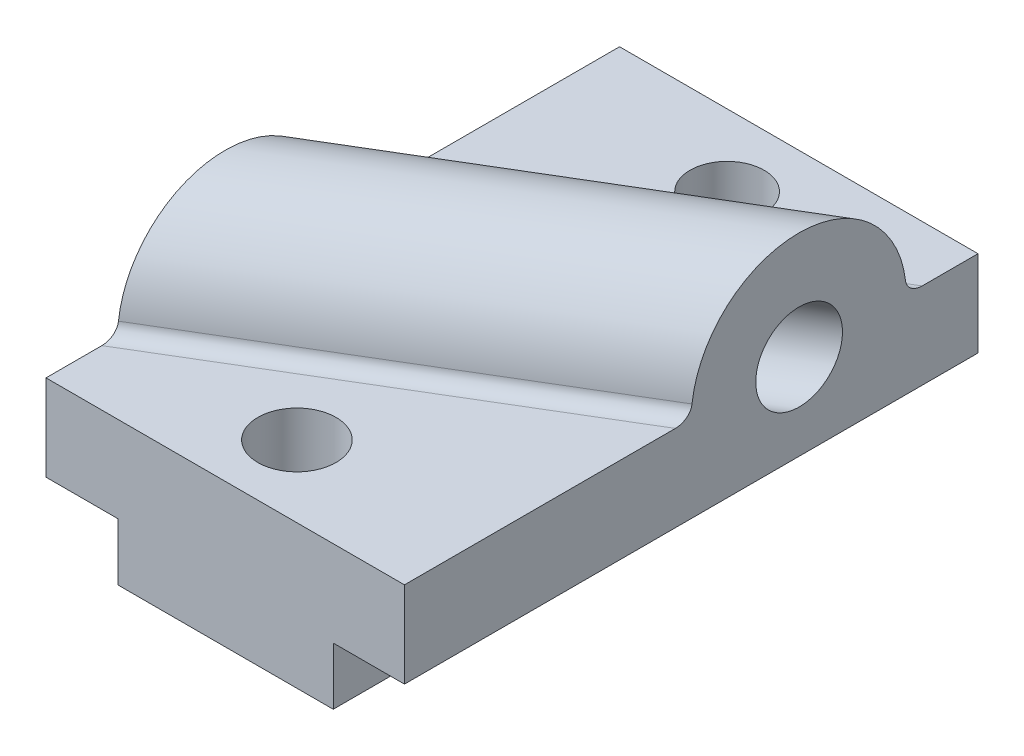
ISO-10303-21;
HEADER;
FILE_DESCRIPTION(('STEP AP214'),'2;1');
FILE_NAME('part.step','',(''),(''),'','','');
FILE_SCHEMA(('AUTOMOTIVE_DESIGN { 1 0 10303 214 1 1 1 1 }'));
ENDSEC;
DATA;
#1=APPLICATION_CONTEXT('core data for automotive mechanical design processes');
#2=APPLICATION_PROTOCOL_DEFINITION('international standard','automotive_design',2000,#1);
#3=PRODUCT_CONTEXT('',#1,'mechanical');
#4=PRODUCT('Part','Part','',(#3));
#5=PRODUCT_RELATED_PRODUCT_CATEGORY('part','',(#4));
#6=PRODUCT_DEFINITION_FORMATION('','',#4);
#7=PRODUCT_DEFINITION_CONTEXT('part definition',#1,'design');
#8=PRODUCT_DEFINITION('design','',#6,#7);
#9=PRODUCT_DEFINITION_SHAPE('','',#8);
#10=(LENGTH_UNIT() NAMED_UNIT(*) SI_UNIT(.MILLI.,.METRE.));
#11=(NAMED_UNIT(*) PLANE_ANGLE_UNIT() SI_UNIT($,.RADIAN.));
#12=(NAMED_UNIT(*) SI_UNIT($,.STERADIAN.) SOLID_ANGLE_UNIT());
#13=UNCERTAINTY_MEASURE_WITH_UNIT(LENGTH_MEASURE(1.E-05),#10,'distance_accuracy_value','');
#14=(GEOMETRIC_REPRESENTATION_CONTEXT(3) GLOBAL_UNCERTAINTY_ASSIGNED_CONTEXT((#13)) GLOBAL_UNIT_ASSIGNED_CONTEXT((#10,
#11,#12)) REPRESENTATION_CONTEXT('',''));
#15=CARTESIAN_POINT('',(0.,0.,0.));
#16=DIRECTION('',(0.,0.,1.));
#17=DIRECTION('',(1.,0.,0.));
#18=AXIS2_PLACEMENT_3D('',#15,#16,#17);
#19=CARTESIAN_POINT('',(0.,12.,0.));
#20=DIRECTION('',(0.,1.,0.));
#21=DIRECTION('',(0.,0.,1.));
#22=AXIS2_PLACEMENT_3D('',#19,#20,#21);
#23=PLANE('',#22);
#24=CARTESIAN_POINT('',(21.6244596219272,12.,29.766326452306));
#25=DIRECTION('',(0.,1.,0.));
#26=DIRECTION('',(0.,0.,1.));
#27=AXIS2_PLACEMENT_3D('',#24,#25,#26);
#28=CIRCLE('',#27,5.45800392920882);
#29=CARTESIAN_POINT('',(21.6244596219272,12.,35.2243303815149));
#30=VERTEX_POINT('',#29);
#31=EDGE_CURVE('E242',#30,#30,#28,.T.);
#32=ORIENTED_EDGE('',*,*,#31,.F.);
#33=EDGE_LOOP('',(#32));
#34=FACE_BOUND('',#33,.T.);
#35=DIRECTION('',(0.,0.,-1.));
#36=VECTOR('',#35,1.);
#37=CARTESIAN_POINT('',(46.6244596219272,12.,-40.233673547694));
#38=LINE('',#37,#36);
#39=CARTESIAN_POINT('',(46.6244596219272,12.,39.766326452306));
#40=VERTEX_POINT('',#39);
#41=CARTESIAN_POINT('',(46.6244596219272,12.,1.97863456283437));
#42=VERTEX_POINT('',#41);
#43=EDGE_CURVE('E186',#40,#42,#38,.T.);
#44=ORIENTED_EDGE('',*,*,#43,.T.);
#45=DIRECTION('',(-0.857492925712544,0.,0.514495755427526));
#46=VECTOR('',#45,1.);
#47=CARTESIAN_POINT('',(-2.3995220940162,12.,31.3930235924004));
#48=LINE('',#47,#46);
#49=CARTESIAN_POINT('',(-3.37554037807282,12.,31.9786345628344));
#50=VERTEX_POINT('',#49);
#51=EDGE_CURVE('E71',#42,#50,#48,.T.);
#52=ORIENTED_EDGE('',*,*,#51,.T.);
#53=DIRECTION('',(0.,0.,1.));
#54=VECTOR('',#53,1.);
#55=CARTESIAN_POINT('',(-3.37554037807282,12.,-40.233673547694));
#56=LINE('',#55,#54);
#57=CARTESIAN_POINT('',(-3.37554037807282,12.,39.766326452306));
#58=VERTEX_POINT('',#57);
#59=EDGE_CURVE('E182',#50,#58,#56,.T.);
#60=ORIENTED_EDGE('',*,*,#59,.T.);
#61=DIRECTION('',(1.,0.,0.));
#62=VECTOR('',#61,1.);
#63=CARTESIAN_POINT('',(-3.37554037807282,12.,39.766326452306));
#64=LINE('',#63,#62);
#65=EDGE_CURVE('E181',#58,#40,#64,.T.);
#66=ORIENTED_EDGE('',*,*,#65,.T.);
#67=EDGE_LOOP('',(#44,#52,#60,#66));
#68=FACE_BOUND('',#67,.T.);
#69=ADVANCED_FACE('F47',(#34,#68),#23,.T.);
#70=CARTESIAN_POINT('',(0.,0.,0.));
#71=DIRECTION('',(0.,1.,0.));
#72=DIRECTION('',(0.,0.,1.));
#73=AXIS2_PLACEMENT_3D('',#70,#71,#72);
#74=PLANE('',#73);
#75=DIRECTION('',(0.,0.,-1.));
#76=VECTOR('',#75,1.);
#77=CARTESIAN_POINT('',(6.69157462229326,0.,39.766326452306));
#78=LINE('',#77,#76);
#79=CARTESIAN_POINT('',(6.69157462229326,0.,39.766326452306));
#80=VERTEX_POINT('',#79);
#81=CARTESIAN_POINT('',(6.69157462229326,0.,-40.233673547694));
#82=VERTEX_POINT('',#81);
#83=EDGE_CURVE('E164',#80,#82,#78,.T.);
#84=ORIENTED_EDGE('',*,*,#83,.F.);
#85=DIRECTION('',(1.,0.,0.));
#86=VECTOR('',#85,1.);
#87=CARTESIAN_POINT('',(-3.37554037807282,0.,39.766326452306));
#88=LINE('',#87,#86);
#89=CARTESIAN_POINT('',(-3.37554037807282,0.,39.766326452306));
#90=VERTEX_POINT('',#89);
#91=EDGE_CURVE('E193',#90,#80,#88,.T.);
#92=ORIENTED_EDGE('',*,*,#91,.F.);
#93=DIRECTION('',(0.,0.,1.));
#94=VECTOR('',#93,1.);
#95=CARTESIAN_POINT('',(-3.37554037807282,0.,-40.233673547694));
#96=LINE('',#95,#94);
#97=CARTESIAN_POINT('',(-3.37554037807282,0.,-40.233673547694));
#98=VERTEX_POINT('',#97);
#99=EDGE_CURVE('E166',#98,#90,#96,.T.);
#100=ORIENTED_EDGE('',*,*,#99,.F.);
#101=DIRECTION('',(-1.,0.,0.));
#102=VECTOR('',#101,1.);
#103=CARTESIAN_POINT('',(-3.37554037807282,0.,-40.233673547694));
#104=LINE('',#103,#102);
#105=EDGE_CURVE('E200',#82,#98,#104,.T.);
#106=ORIENTED_EDGE('',*,*,#105,.F.);
#107=EDGE_LOOP('',(#84,#92,#100,#106));
#108=FACE_BOUND('',#107,.T.);
#109=ADVANCED_FACE('F307',(#108),#74,.F.);
#110=DIRECTION('',(0.,0.,1.));
#111=VECTOR('',#110,1.);
#112=CARTESIAN_POINT('',(36.6915746222933,0.,39.766326452306));
#113=LINE('',#112,#111);
#114=CARTESIAN_POINT('',(36.6915746222933,0.,-40.233673547694));
#115=VERTEX_POINT('',#114);
#116=CARTESIAN_POINT('',(36.6915746222933,0.,39.766326452306));
#117=VERTEX_POINT('',#116);
#118=EDGE_CURVE('E161',#115,#117,#113,.T.);
#119=ORIENTED_EDGE('',*,*,#118,.F.);
#120=CARTESIAN_POINT('',(46.6244596219272,0.,-40.233673547694));
#121=VERTEX_POINT('',#120);
#122=EDGE_CURVE('E201',#121,#115,#104,.T.);
#123=ORIENTED_EDGE('',*,*,#122,.F.);
#124=DIRECTION('',(0.,0.,-1.));
#125=VECTOR('',#124,1.);
#126=CARTESIAN_POINT('',(46.6244596219272,0.,-40.233673547694));
#127=LINE('',#126,#125);
#128=CARTESIAN_POINT('',(46.6244596219272,0.,39.766326452306));
#129=VERTEX_POINT('',#128);
#130=EDGE_CURVE('E197',#129,#121,#127,.T.);
#131=ORIENTED_EDGE('',*,*,#130,.F.);
#132=EDGE_CURVE('E171',#117,#129,#88,.T.);
#133=ORIENTED_EDGE('',*,*,#132,.F.);
#134=EDGE_LOOP('',(#119,#123,#131,#133));
#135=FACE_BOUND('',#134,.T.);
#136=ADVANCED_FACE('F294',(#135),#74,.F.);
#137=CARTESIAN_POINT('',(-3.37554037807282,12.,-40.233673547694));
#138=DIRECTION('',(1.,0.,0.));
#139=DIRECTION('',(0.,0.,-1.));
#140=AXIS2_PLACEMENT_3D('',#137,#138,#139);
#141=PLANE('',#140);
#142=CARTESIAN_POINT('',(-3.37554037807282,12.,8.66905887137775));
#143=CARTESIAN_POINT('',(-3.37554037807282,12.1863945217488,8.66905411769737));
#144=CARTESIAN_POINT('',(-3.37554037807282,12.3727326558007,8.6776762489083));
#145=CARTESIAN_POINT('',(-3.37554037807282,12.7438744230989,8.71208449362544));
#146=CARTESIAN_POINT('',(-3.37554037807282,12.9286778828835,8.73787252133408));
#147=CARTESIAN_POINT('',(-3.37554037807282,13.276622419932,8.80293912498226));
#148=CARTESIAN_POINT('',(-3.37554037807282,13.4400697502755,8.84059631793459));
#149=CARTESIAN_POINT('',(-3.37554037807282,13.763330186289,8.92936523419148));
#150=CARTESIAN_POINT('',(-3.37554037807282,13.9231421586503,8.98048109238946));
#151=CARTESIAN_POINT('',(-3.37554037807282,14.2379146297517,9.09578941851281));
#152=CARTESIAN_POINT('',(-3.37554037807282,14.3928767210017,9.159977540929));
#153=CARTESIAN_POINT('',(-3.37554037807282,14.6969915521493,9.30102288474687));
#154=CARTESIAN_POINT('',(-3.37554037807282,14.8461422019897,9.37788461309364));
#155=CARTESIAN_POINT('',(-3.37554037807282,15.1374923203284,9.54370021641593));
#156=CARTESIAN_POINT('',(-3.37554037807282,15.2796942543089,9.63264975951779));
#157=CARTESIAN_POINT('',(-3.37554037807282,15.5562720121972,9.82208187157871));
#158=CARTESIAN_POINT('',(-3.37554037807282,15.6906450104112,9.92256856623757));
#159=CARTESIAN_POINT('',(-3.37554037807282,15.9505343401455,10.1343168208482));
#160=CARTESIAN_POINT('',(-3.37554037807282,16.0760538309768,10.2455745032809));
#161=CARTESIAN_POINT('',(-3.37554037807282,16.3174658695357,10.4781686121084));
#162=CARTESIAN_POINT('',(-3.37554037807282,16.4333549462729,10.5995086411374));
#163=CARTESIAN_POINT('',(-3.37554037807282,16.654615300324,10.8513491620773));
#164=CARTESIAN_POINT('',(-3.37554037807282,16.7599903359451,10.9818463520892));
#165=CARTESIAN_POINT('',(-3.37554037807282,16.9595781649421,11.2511871970143));
#166=CARTESIAN_POINT('',(-3.37554037807282,17.0537869388435,11.3900338304974));
#167=CARTESIAN_POINT('',(-3.37554037807282,17.2303156514759,11.6750205096382));
#168=CARTESIAN_POINT('',(-3.37554037807282,17.312639843217,11.8211579209051));
#169=CARTESIAN_POINT('',(-3.37554037807282,17.4648985604157,12.1198167076749));
#170=CARTESIAN_POINT('',(-3.37554037807282,17.5348286288632,12.2723403554352));
#171=CARTESIAN_POINT('',(-3.37554037807282,17.6617567890039,12.5826129025299));
#172=CARTESIAN_POINT('',(-3.37554037807282,17.718759511064,12.7403599076668));
#173=CARTESIAN_POINT('',(-3.37554037807282,17.8194896488361,13.0600991096675));
#174=CARTESIAN_POINT('',(-3.37554037807282,17.8632122929598,13.2220928097302));
#175=CARTESIAN_POINT('',(-3.37554037807282,17.9370389201337,13.5490939032755));
#176=CARTESIAN_POINT('',(-3.37554037807282,17.967147783273,13.7141001947418));
#177=CARTESIAN_POINT('',(-3.37554037807282,18.0135715505829,14.0460994153488));
#178=CARTESIAN_POINT('',(-3.37554037807282,18.0298815004948,14.2130930362027));
#179=CARTESIAN_POINT('',(-3.37554037807282,18.0485685532838,14.5478093468453));
#180=CARTESIAN_POINT('',(-3.37554037807282,18.0509506524928,14.7155317535868));
#181=CARTESIAN_POINT('',(-3.37554037807282,18.0417943457889,15.050612342494));
#182=CARTESIAN_POINT('',(-3.37554037807282,18.0302509437735,15.2179703723449));
#183=CARTESIAN_POINT('',(-3.37554037807282,17.9747900112995,15.717633061632));
#184=CARTESIAN_POINT('',(-3.37554037807282,17.9100611780442,16.0478797323629));
#185=CARTESIAN_POINT('',(-3.37554037807282,17.7268653059226,16.6929291543961));
#186=CARTESIAN_POINT('',(-3.37554037807282,17.6083982670562,17.0077319056984));
#187=CARTESIAN_POINT('',(-3.37554037807282,17.3209902584631,17.6134368094151));
#188=CARTESIAN_POINT('',(-3.37554037807282,17.1520492887363,17.9043389618296));
#189=CARTESIAN_POINT('',(-3.37554037807282,16.7683538991475,18.4541586326761));
#190=CARTESIAN_POINT('',(-3.37554037807282,16.5535994792855,18.713076151108));
#191=CARTESIAN_POINT('',(-3.37554037807282,16.0842001777317,19.1918014837958));
#192=CARTESIAN_POINT('',(-3.37554037807282,15.82955529604,19.4116092980517));
#193=CARTESIAN_POINT('',(-3.37554037807282,15.2873985842174,19.8060482765394));
#194=CARTESIAN_POINT('',(-3.37554037807282,14.9998867540866,19.9806794407711));
#195=CARTESIAN_POINT('',(-3.37554037807282,14.3999260955644,20.2799497191191));
#196=CARTESIAN_POINT('',(-3.37554037807282,14.0874772671729,20.4045888332352));
#197=CARTESIAN_POINT('',(-3.37554037807282,13.4462603797695,20.6004369847407));
#198=CARTESIAN_POINT('',(-3.37554037807282,13.1174923207575,20.6716460221299));
#199=CARTESIAN_POINT('',(-3.37554037807282,12.4527048398584,20.7586700558923));
#200=CARTESIAN_POINT('',(-3.37554037807282,12.1166854179712,20.7744850522654));
#201=CARTESIAN_POINT('',(-3.37554037807282,11.4466630860789,20.7502848047876));
#202=CARTESIAN_POINT('',(-3.37554037807282,11.1126601760737,20.7102695609366));
#203=CARTESIAN_POINT('',(-3.37554037807282,10.4558831127033,20.5755124306242));
#204=CARTESIAN_POINT('',(-3.37554037807282,10.1331089593381,20.4807705441629));
#205=CARTESIAN_POINT('',(-3.37554037807282,9.50769199252309,20.2391735472924));
#206=CARTESIAN_POINT('',(-3.37554037807282,9.20504917907326,20.0923184368833));
#207=CARTESIAN_POINT('',(-3.37554037807282,8.62824206602815,19.7505442976258));
#208=CARTESIAN_POINT('',(-3.37554037807282,8.35407776643287,19.5556252687775));
#209=CARTESIAN_POINT('',(-3.37554037807282,7.84178997463079,19.1231037469698));
#210=CARTESIAN_POINT('',(-3.37554037807282,7.60366648242398,18.8855012540106));
#211=CARTESIAN_POINT('',(-3.37554037807282,7.17002632141783,18.3741500701809));
#212=CARTESIAN_POINT('',(-3.37554037807282,6.9745096526185,18.1004013793106));
#213=CARTESIAN_POINT('',(-3.37554037807282,6.63148229710049,17.5243683705721));
#214=CARTESIAN_POINT('',(-3.37554037807282,6.48397161038183,17.222084052704));
#215=CARTESIAN_POINT('',(-3.37554037807282,6.24100034377283,16.5970924943368));
#216=CARTESIAN_POINT('',(-3.37554037807282,6.1455397638825,16.2743852538378));
#217=CARTESIAN_POINT('',(-3.37554037807282,6.04339398947198,15.7821404378503));
#218=CARTESIAN_POINT('',(-3.37554037807282,6.01618278327872,15.6166064215783));
#219=CARTESIAN_POINT('',(-3.37554037807282,5.97559504963841,15.2838670717971));
#220=CARTESIAN_POINT('',(-3.37554037807282,5.96221356248044,15.1166623591803));
#221=CARTESIAN_POINT('',(-3.37554037807282,5.94938031901045,14.7816705347814));
#222=CARTESIAN_POINT('',(-3.37554037807282,5.94993356352848,14.6138832355227));
#223=CARTESIAN_POINT('',(-3.37554037807282,5.96496962073294,14.2789913639602));
#224=CARTESIAN_POINT('',(-3.37554037807282,5.97944743609337,14.1118865683217));
#225=CARTESIAN_POINT('',(-3.37554037807282,6.02223465786303,13.7793969598935));
#226=CARTESIAN_POINT('',(-3.37554037807282,6.05054902629369,13.6140127858941));
#227=CARTESIAN_POINT('',(-3.37554037807282,6.12080289119148,13.2862260985223));
#228=CARTESIAN_POINT('',(-3.37554037807282,6.16273749597814,13.1238225367597));
#229=CARTESIAN_POINT('',(-3.37554037807282,6.25996271328053,12.8030000493404));
#230=CARTESIAN_POINT('',(-3.37554037807282,6.31525811360298,12.6445825746077));
#231=CARTESIAN_POINT('',(-3.37554037807282,6.43879271606855,12.3329433763926));
#232=CARTESIAN_POINT('',(-3.37554037807282,6.50702726748722,12.1797198093157));
#233=CARTESIAN_POINT('',(-3.37554037807282,6.65600870879236,11.8794127601947));
#234=CARTESIAN_POINT('',(-3.37554037807282,6.73676008030685,11.7323315014329));
#235=CARTESIAN_POINT('',(-3.37554037807282,6.91016821285915,11.4454353326511));
#236=CARTESIAN_POINT('',(-3.37554037807282,7.00282069245568,11.3056178347641));
#237=CARTESIAN_POINT('',(-3.37554037807282,7.19944923482111,11.0341090733666));
#238=CARTESIAN_POINT('',(-3.37554037807282,7.30342934922659,10.902420744033));
#239=CARTESIAN_POINT('',(-3.37554037807282,7.52192817800647,10.6481805987722));
#240=CARTESIAN_POINT('',(-3.37554037807282,7.63644309868836,10.5256255224209));
#241=CARTESIAN_POINT('',(-3.37554037807282,7.87529544504687,10.2904036548801));
#242=CARTESIAN_POINT('',(-3.37554037807282,7.99963637775707,10.1777404247845));
#243=CARTESIAN_POINT('',(-3.37554037807282,8.25719933512301,9.96316859570164));
#244=CARTESIAN_POINT('',(-3.37554037807282,8.39041816342098,9.86125615981685));
#245=CARTESIAN_POINT('',(-3.37554037807282,8.6649061210144,9.66880927336768));
#246=CARTESIAN_POINT('',(-3.37554037807282,8.80617807973665,9.57827885807761));
#247=CARTESIAN_POINT('',(-3.37554037807282,9.09570021320399,9.40929355705348));
#248=CARTESIAN_POINT('',(-3.37554037807282,9.2439479373859,9.33083447145123));
#249=CARTESIAN_POINT('',(-3.37554037807282,9.54648940442346,9.18647685390586));
#250=CARTESIAN_POINT('',(-3.37554037807282,9.70078460175736,9.12058136626156));
#251=CARTESIAN_POINT('',(-3.37554037807282,10.0142661469274,9.0018426813819));
#252=CARTESIAN_POINT('',(-3.37554037807282,10.1734518309458,8.94899772143753));
#253=CARTESIAN_POINT('',(-3.37554037807282,10.6022064365446,8.82621180178058));
#254=CARTESIAN_POINT('',(-3.37554037807282,10.8752359177443,8.7680337135839));
#255=CARTESIAN_POINT('',(-3.37554037807282,11.4321486184569,8.68908104424492));
#256=CARTESIAN_POINT('',(-3.37554037807282,11.7161396971293,8.66906611075978));
#257=CARTESIAN_POINT('',(-3.37554037807282,12.,8.66905887137775));
#258=B_SPLINE_CURVE_WITH_KNOTS('',3,(#142,#143,#144,#145,#146,#147,#148,#149,#150,#151,#152,
#153,#154,#155,#156,#157,#158,#159,#160,#161,#162,#163,#164,#165,#166,#167,#168,#169,#170,#171,
#172,#173,#174,#175,#176,#177,#178,#179,#180,#181,#182,#183,#184,#185,#186,#187,#188,#189,#190,
#191,#192,#193,#194,#195,#196,#197,#198,#199,#200,#201,#202,#203,#204,#205,#206,#207,#208,#209,
#210,#211,#212,#213,#214,#215,#216,#217,#218,#219,#220,#221,#222,#223,#224,#225,#226,#227,#228,
#229,#230,#231,#232,#233,#234,#235,#236,#237,#238,#239,#240,#241,#242,#243,#244,#245,#246,#247,
#248,#249,#250,#251,#252,#253,#254,#255,#256,#257),.UNSPECIFIED.,.T.,.F.,(4,2,2,2,2,2,2,2,2,2,2,
2,2,2,2,2,2,2,2,2,2,2,2,2,2,2,2,2,2,2,2,2,2,2,2,2,2,2,2,2,2,2,2,2,2,2,2,2,2,2,2,2,2,2,2,2,2,4),
(0.,0.558889960645849,1.11784225463839,1.6204667270335,2.12324580083801,2.62585801179388,
3.12864934703064,3.63126097129396,4.13405289322293,4.6366644801081,5.13945643941523,
5.64206802395097,6.14485998560752,6.64747157000275,7.1502635317998,7.65287511618719,
8.15566707799202,8.65827866237898,9.1610706241842,9.66368220857111,10.1664741703764,
11.1710092676643,12.1755443649523,13.1800794622403,14.1846145595282,15.1891496568162,
16.1936847541041,17.1982198513921,18.2027549486801,19.207290045968,20.211825143256,
21.2163602405439,22.2208953378319,23.2254304351199,24.2299655324078,25.2345006296958,
26.2390357269838,27.2435708242717,27.746362786077,28.2489743704639,28.7517663322691,
29.2543779166561,29.7571698784596,30.2597814628483,30.7625734246192,31.2651850090405,
31.7679769702335,32.2705885552328,32.7733805068612,33.2759921014251,33.7787839020223,
34.2813956476175,34.7841850849571,35.2867991938113,35.7895349372734,36.2922027400275,
37.1268885762421,37.9780223542731),.UNSPECIFIED.);
#259=CARTESIAN_POINT('',(-3.37554037807282,12.,8.66905887137775));
#260=VERTEX_POINT('',#259);
#261=EDGE_CURVE('E275',#260,#260,#258,.T.);
#262=ORIENTED_EDGE('',*,*,#261,.T.);
#263=EDGE_LOOP('',(#262));
#264=FACE_BOUND('',#263,.T.);
#265=ORIENTED_EDGE('',*,*,#99,.T.);
#266=DIRECTION('',(0.,-1.,0.));
#267=VECTOR('',#266,1.);
#268=CARTESIAN_POINT('',(-3.37554037807282,12.,39.766326452306));
#269=LINE('',#268,#267);
#270=EDGE_CURVE('E215',#58,#90,#269,.T.);
#271=ORIENTED_EDGE('',*,*,#270,.F.);
#272=ORIENTED_EDGE('',*,*,#59,.F.);
#273=CARTESIAN_POINT('',(-3.37554037807282,14.,31.9786345628344));
#274=DIRECTION('',(1.,0.,0.));
#275=DIRECTION('',(0.,0.,-1.));
#276=AXIS2_PLACEMENT_3D('',#273,#274,#275);
#277=ELLIPSE('',#276,2.33238075793812,2.);
#278=CARTESIAN_POINT('',(-3.37554037807282,13.7944468829577,29.6586050014148));
#279=VERTEX_POINT('',#278);
#280=EDGE_CURVE('E11',#50,#279,#277,.T.);
#281=ORIENTED_EDGE('',*,*,#280,.T.);
#282=CARTESIAN_POINT('',(-3.37554037807282,12.,29.766326452306));
#283=CARTESIAN_POINT('',(-3.37554037807282,12.231150875315,29.7663257150185));
#284=CARTESIAN_POINT('',(-3.37554037807282,12.4622655448004,29.7609822236431));
#285=CARTESIAN_POINT('',(-3.37554037807282,12.924001779988,29.7396246135337));
#286=CARTESIAN_POINT('',(-3.37554037807282,13.1546233446206,29.7236104716775));
#287=CARTESIAN_POINT('',(-3.37554037807282,13.8448592933815,29.6596082145067));
#288=CARTESIAN_POINT('',(-3.37554037807282,14.3031035142492,29.5956602269506));
#289=CARTESIAN_POINT('',(-3.37554037807282,15.1659821367685,29.434301530797));
#290=CARTESIAN_POINT('',(-3.37554037807282,15.5713786398898,29.3408964705641));
#291=CARTESIAN_POINT('',(-3.37554037807282,16.3730213913311,29.1207472244424));
#292=CARTESIAN_POINT('',(-3.37554037807282,16.7692681565873,28.9940049270572));
#293=CARTESIAN_POINT('',(-3.37554037807282,17.5498727126709,28.7080521551673));
#294=CARTESIAN_POINT('',(-3.37554037807282,17.9342301572264,28.5488407360353));
#295=CARTESIAN_POINT('',(-3.37554037807282,18.6883984707616,28.1990514017785));
#296=CARTESIAN_POINT('',(-3.37554037807282,19.0582093623594,28.0084735354273));
#297=CARTESIAN_POINT('',(-3.37554037807282,19.7807297609525,27.5972667524362));
#298=CARTESIAN_POINT('',(-3.37554037807282,20.1334391928122,27.376637703782));
#299=CARTESIAN_POINT('',(-3.37554037807282,20.8193168841524,26.9068548107311));
#300=CARTESIAN_POINT('',(-3.37554037807282,21.1524852849214,26.6577011726159));
#301=CARTESIAN_POINT('',(-3.37554037807282,21.7969830209065,26.1325881322503));
#302=CARTESIAN_POINT('',(-3.37554037807282,22.1083123021313,25.8566286637339));
#303=CARTESIAN_POINT('',(-3.37554037807282,22.7069811991174,25.2798099382265));
#304=CARTESIAN_POINT('',(-3.37554037807282,22.994320760012,24.9789506242904));
#305=CARTESIAN_POINT('',(-3.37554037807282,23.5430244530138,24.3544111249288));
#306=CARTESIAN_POINT('',(-3.37554037807282,23.8043886058679,24.030730957731));
#307=CARTESIAN_POINT('',(-3.37554037807282,24.2993362633661,23.362785515823));
#308=CARTESIAN_POINT('',(-3.37554037807282,24.5329197871669,23.0185202553078));
#309=CARTESIAN_POINT('',(-3.37554037807282,24.9706930255701,22.3117822687255));
#310=CARTESIAN_POINT('',(-3.37554037807282,25.1748827329845,21.949309538206));
#311=CARTESIAN_POINT('',(-3.37554037807282,25.5524579161808,21.2086603103726));
#312=CARTESIAN_POINT('',(-3.37554037807282,25.7258433857868,20.8304838099101));
#313=CARTESIAN_POINT('',(-3.37554037807282,26.0406124118247,20.0610393043347));
#314=CARTESIAN_POINT('',(-3.37554037807282,26.1819959705426,19.6697713001568));
#315=CARTESIAN_POINT('',(-3.37554037807282,26.4317846093928,18.8768463771481));
#316=CARTESIAN_POINT('',(-3.37554037807282,26.5401896914259,18.475189458916));
#317=CARTESIAN_POINT('',(-3.37554037807282,26.7232726067544,17.6642610302284));
#318=CARTESIAN_POINT('',(-3.37554037807282,26.7979504394375,17.2549895196346));
#319=CARTESIAN_POINT('',(-3.37554037807282,26.9130630346754,16.4316588521262));
#320=CARTESIAN_POINT('',(-3.37554037807282,26.9534977965003,16.0175996951097));
#321=CARTESIAN_POINT('',(-3.37554037807282,26.9998449537201,15.1875537589251));
#322=CARTESIAN_POINT('',(-3.37554037807282,27.0057573489762,14.7715669797493));
#323=CARTESIAN_POINT('',(-3.37554037807282,26.9830189345274,13.9405391449844));
#324=CARTESIAN_POINT('',(-3.37554037807282,26.9543681258367,13.5254980893675));
#325=CARTESIAN_POINT('',(-3.37554037807282,26.8627012056991,12.6992285043381));
#326=CARTESIAN_POINT('',(-3.37554037807282,26.7996850955417,12.2879999747826));
#327=CARTESIAN_POINT('',(-3.37554037807282,26.6397228340325,11.4721958484697));
#328=CARTESIAN_POINT('',(-3.37554037807282,26.5427766791387,11.0676202524068));
#329=CARTESIAN_POINT('',(-3.37554037807282,26.3156239451478,10.2679164880792));
#330=CARTESIAN_POINT('',(-3.37554037807282,26.1854173609821,9.87278832125424));
#331=CARTESIAN_POINT('',(-3.37554037807282,25.8926432075582,9.09470889546409));
#332=CARTESIAN_POINT('',(-3.37554037807282,25.7300756515412,8.71175763151654));
#333=CARTESIAN_POINT('',(-3.37554037807282,25.3737025218475,7.96067720621432));
#334=CARTESIAN_POINT('',(-3.37554037807282,25.179896966315,7.5925480362506));
#335=CARTESIAN_POINT('',(-3.37554037807282,24.7623861063493,6.87365376075724));
#336=CARTESIAN_POINT('',(-3.37554037807282,24.5386807549489,6.5228886825047));
#337=CARTESIAN_POINT('',(-3.37554037807282,24.0629152222704,5.84114530928655));
#338=CARTESIAN_POINT('',(-3.37554037807282,23.810854980079,5.51016705683037));
#339=CARTESIAN_POINT('',(-3.37554037807282,23.280122664938,4.87028619872267));
#340=CARTESIAN_POINT('',(-3.37554037807282,23.0014507481396,4.56138346355563));
#341=CARTESIAN_POINT('',(-3.37554037807282,22.4194209623497,3.96778746394682));
#342=CARTESIAN_POINT('',(-3.37554037807282,22.1160632840189,3.68309401255922));
#343=CARTESIAN_POINT('',(-3.37554037807282,21.4867486371366,3.1398745088659));
#344=CARTESIAN_POINT('',(-3.37554037807282,21.1607911870607,2.88134901439938));
#345=CARTESIAN_POINT('',(-3.37554037807282,20.4885398871661,2.39226201646286));
#346=CARTESIAN_POINT('',(-3.37554037807282,20.1422463586192,2.16170007139755));
#347=CARTESIAN_POINT('',(-3.37554037807282,19.4317053749719,1.73012547916077));
#348=CARTESIAN_POINT('',(-3.37554037807282,19.0674577354276,1.5291131356389));
#349=CARTESIAN_POINT('',(-3.37554037807282,18.3235815641203,1.15805473928498));
#350=CARTESIAN_POINT('',(-3.37554037807282,17.9439550900974,0.988004560231326));
#351=CARTESIAN_POINT('',(-3.37554037807282,17.171782923169,0.679968758497933));
#352=CARTESIAN_POINT('',(-3.37554037807282,16.779233941618,0.541991371166743));
#353=CARTESIAN_POINT('',(-3.37554037807282,16.0278077363248,0.312479910219737));
#354=CARTESIAN_POINT('',(-3.37554037807282,15.6699759534415,0.217506753760961));
#355=CARTESIAN_POINT('',(-3.37554037807282,14.9481563080363,0.0542451841655276));
#356=CARTESIAN_POINT('',(-3.37554037807282,14.5841666812144,-0.014035441360505));
#357=CARTESIAN_POINT('',(-3.37554037807282,13.8511325653558,-0.123635571011372));
#358=CARTESIAN_POINT('',(-3.37554037807282,13.4820769549971,-0.164880656091204));
#359=CARTESIAN_POINT('',(-3.37554037807282,12.7420153023825,-0.219909738040611));
#360=CARTESIAN_POINT('',(-3.37554037807282,12.3710097587472,-0.233700442532734));
#361=CARTESIAN_POINT('',(-3.37554037807282,12.,-0.23367354769396));
#362=B_SPLINE_CURVE_WITH_KNOTS('',3,(#282,#283,#284,#285,#286,#287,#288,#289,#290,#291,#292,
#293,#294,#295,#296,#297,#298,#299,#300,#301,#302,#303,#304,#305,#306,#307,#308,#309,#310,#311,
#312,#313,#314,#315,#316,#317,#318,#319,#320,#321,#322,#323,#324,#325,#326,#327,#328,#329,#330,
#331,#332,#333,#334,#335,#336,#337,#338,#339,#340,#341,#342,#343,#344,#345,#346,#347,#348,#349,
#350,#351,#352,#353,#354,#355,#356,#357,#358,#359,#360,#361),.UNSPECIFIED.,.F.,.F.,(4,2,2,2,2,2,
2,2,2,2,2,2,2,2,2,2,2,2,2,2,2,2,2,2,2,2,2,2,2,2,2,2,2,2,2,2,2,2,2,4),(0.,0.69331858797328,
1.38663867830386,2.77250607784132,4.01919093224177,5.26580517904807,6.51245569889261,
7.75910428025669,9.00575833829572,10.252403381465,11.4990515065098,12.7457024826733,
13.9923524631061,15.2390015838817,16.4856510095149,17.73230068509,18.9789502716173,
20.2255997862983,21.4722493236167,22.7188988875066,23.965548456401,25.2121979887149,
26.4588474742503,27.7054970899232,28.9521468955737,30.1987961911315,31.4454447625921,
32.6920952923398,33.9387485002579,35.1853943935481,36.432030659275,37.6786934947562,
38.9253366405999,40.1719925959649,41.4184822919659,42.6652916971381,43.7749641005518,
44.8849600123908,45.9979986509634,47.1107653198321),.UNSPECIFIED.);
#363=CARTESIAN_POINT('',(-3.37554037807282,13.7944468829577,-0.125952096802669));
#364=VERTEX_POINT('',#363);
#365=EDGE_CURVE('E284',#279,#364,#362,.T.);
#366=ORIENTED_EDGE('',*,*,#365,.T.);
#367=CARTESIAN_POINT('',(-3.37554037807282,14.,-2.44598165822229));
#368=DIRECTION('',(1.,0.,0.));
#369=DIRECTION('',(0.,0.,-1.));
#370=AXIS2_PLACEMENT_3D('',#367,#368,#369);
#371=ELLIPSE('',#370,2.33238075793812,2.);
#372=CARTESIAN_POINT('',(-3.37554037807282,12.,-2.44598165822228));
#373=VERTEX_POINT('',#372);
#374=EDGE_CURVE('E235',#364,#373,#371,.T.);
#375=ORIENTED_EDGE('',*,*,#374,.T.);
#376=CARTESIAN_POINT('',(-3.37554037807282,12.,-40.233673547694));
#377=VERTEX_POINT('',#376);
#378=EDGE_CURVE('E177',#377,#373,#56,.T.);
#379=ORIENTED_EDGE('',*,*,#378,.F.);
#380=DIRECTION('',(0.,-1.,0.));
#381=VECTOR('',#380,1.);
#382=CARTESIAN_POINT('',(-3.37554037807282,12.,-40.233673547694));
#383=LINE('',#382,#381);
#384=EDGE_CURVE('E191',#377,#98,#383,.T.);
#385=ORIENTED_EDGE('',*,*,#384,.T.);
#386=EDGE_LOOP('',(#265,#271,#272,#281,#366,#375,#379,#385));
#387=FACE_BOUND('',#386,.T.);
#388=ADVANCED_FACE('F289',(#264,#387),#141,.F.);
#389=CARTESIAN_POINT('',(-3.37554037807282,12.,39.766326452306));
#390=DIRECTION('',(0.,0.,-1.));
#391=DIRECTION('',(-1.,0.,0.));
#392=AXIS2_PLACEMENT_3D('',#389,#390,#391);
#393=PLANE('',#392);
#394=ORIENTED_EDGE('',*,*,#91,.T.);
#395=DIRECTION('',(0.,1.,0.));
#396=VECTOR('',#395,1.);
#397=CARTESIAN_POINT('',(6.69157462229326,-8.,39.766326452306));
#398=LINE('',#397,#396);
#399=CARTESIAN_POINT('',(6.69157462229326,-8.,39.766326452306));
#400=VERTEX_POINT('',#399);
#401=EDGE_CURVE('E351',#400,#80,#398,.T.);
#402=ORIENTED_EDGE('',*,*,#401,.F.);
#403=DIRECTION('',(-1.,0.,0.));
#404=VECTOR('',#403,1.);
#405=CARTESIAN_POINT('',(36.6915746222933,-8.,39.766326452306));
#406=LINE('',#405,#404);
#407=CARTESIAN_POINT('',(36.6915746222933,-8.,39.766326452306));
#408=VERTEX_POINT('',#407);
#409=EDGE_CURVE('E156',#408,#400,#406,.T.);
#410=ORIENTED_EDGE('',*,*,#409,.F.);
#411=DIRECTION('',(0.,1.,0.));
#412=VECTOR('',#411,1.);
#413=CARTESIAN_POINT('',(36.6915746222933,-8.,39.766326452306));
#414=LINE('',#413,#412);
#415=EDGE_CURVE('E173',#408,#117,#414,.T.);
#416=ORIENTED_EDGE('',*,*,#415,.T.);
#417=ORIENTED_EDGE('',*,*,#132,.T.);
#418=DIRECTION('',(0.,-1.,0.));
#419=VECTOR('',#418,1.);
#420=CARTESIAN_POINT('',(46.6244596219272,12.,39.766326452306));
#421=LINE('',#420,#419);
#422=EDGE_CURVE('E211',#40,#129,#421,.T.);
#423=ORIENTED_EDGE('',*,*,#422,.F.);
#424=ORIENTED_EDGE('',*,*,#65,.F.);
#425=ORIENTED_EDGE('',*,*,#270,.T.);
#426=EDGE_LOOP('',(#394,#402,#410,#416,#417,#423,#424,#425));
#427=FACE_BOUND('',#426,.T.);
#428=ADVANCED_FACE('F293',(#427),#393,.F.);
#429=CARTESIAN_POINT('',(46.6244596219272,12.,-40.233673547694));
#430=DIRECTION('',(-1.,0.,0.));
#431=DIRECTION('',(0.,0.,1.));
#432=AXIS2_PLACEMENT_3D('',#429,#430,#431);
#433=PLANE('',#432);
#434=CARTESIAN_POINT('',(46.6244596219272,12.,-15.2823073381581));
#435=DIRECTION('',(1.,0.,0.));
#436=DIRECTION('',(0.,0.,-1.));
#437=AXIS2_PLACEMENT_3D('',#434,#435,#436);
#438=CIRCLE('',#437,6.04863379046418);
#439=CARTESIAN_POINT('',(46.6244596219272,12.,-21.3309411286222));
#440=VERTEX_POINT('',#439);
#441=EDGE_CURVE('E248',#440,#440,#438,.T.);
#442=ORIENTED_EDGE('',*,*,#441,.F.);
#443=EDGE_LOOP('',(#442));
#444=FACE_BOUND('',#443,.T.);
#445=CARTESIAN_POINT('',(46.6244596219272,12.,-32.4459816582223));
#446=VERTEX_POINT('',#445);
#447=CARTESIAN_POINT('',(46.6244596219272,12.,-40.233673547694));
#448=VERTEX_POINT('',#447);
#449=EDGE_CURVE('E185',#446,#448,#38,.T.);
#450=ORIENTED_EDGE('',*,*,#449,.F.);
#451=CARTESIAN_POINT('',(46.6244596219272,14.,-32.4459816582223));
#452=DIRECTION('',(-1.,0.,0.));
#453=DIRECTION('',(0.,0.,-1.));
#454=AXIS2_PLACEMENT_3D('',#451,#452,#453);
#455=ELLIPSE('',#454,2.33238075793812,2.);
#456=CARTESIAN_POINT('',(46.6244596219272,13.7944468829577,-30.1259520968027));
#457=VERTEX_POINT('',#456);
#458=EDGE_CURVE('E232',#446,#457,#455,.T.);
#459=ORIENTED_EDGE('',*,*,#458,.T.);
#460=CARTESIAN_POINT('',(46.6244596219272,12.,-15.233673547694));
#461=DIRECTION('',(1.,0.,0.));
#462=DIRECTION('',(0.,0.,-1.));
#463=AXIS2_PLACEMENT_3D('',#460,#461,#462);
#464=CIRCLE('',#463,15.);
#465=CARTESIAN_POINT('',(46.6244596219272,13.7944468829577,-0.341394998585253));
#466=VERTEX_POINT('',#465);
#467=EDGE_CURVE('E283',#457,#466,#464,.T.);
#468=ORIENTED_EDGE('',*,*,#467,.T.);
#469=CARTESIAN_POINT('',(46.6244596219272,14.,1.97863456283437));
#470=DIRECTION('',(-1.,0.,0.));
#471=DIRECTION('',(0.,0.,-1.));
#472=AXIS2_PLACEMENT_3D('',#469,#470,#471);
#473=ELLIPSE('',#472,2.33238075793812,2.);
#474=EDGE_CURVE('E57',#466,#42,#473,.T.);
#475=ORIENTED_EDGE('',*,*,#474,.T.);
#476=ORIENTED_EDGE('',*,*,#43,.F.);
#477=ORIENTED_EDGE('',*,*,#422,.T.);
#478=ORIENTED_EDGE('',*,*,#130,.T.);
#479=DIRECTION('',(0.,-1.,0.));
#480=VECTOR('',#479,1.);
#481=CARTESIAN_POINT('',(46.6244596219272,12.,-40.233673547694));
#482=LINE('',#481,#480);
#483=EDGE_CURVE('E207',#448,#121,#482,.T.);
#484=ORIENTED_EDGE('',*,*,#483,.F.);
#485=EDGE_LOOP('',(#450,#459,#468,#475,#476,#477,#478,#484));
#486=FACE_BOUND('',#485,.T.);
#487=ADVANCED_FACE('F325',(#444,#486),#433,.F.);
#488=CARTESIAN_POINT('',(-3.37554037807282,12.,-40.233673547694));
#489=DIRECTION('',(0.,0.,1.));
#490=DIRECTION('',(1.,0.,0.));
#491=AXIS2_PLACEMENT_3D('',#488,#489,#490);
#492=PLANE('',#491);
#493=ORIENTED_EDGE('',*,*,#122,.T.);
#494=DIRECTION('',(0.,1.,0.));
#495=VECTOR('',#494,1.);
#496=CARTESIAN_POINT('',(36.6915746222933,-8.,-40.233673547694));
#497=LINE('',#496,#495);
#498=CARTESIAN_POINT('',(36.6915746222933,-8.,-40.233673547694));
#499=VERTEX_POINT('',#498);
#500=EDGE_CURVE('E146',#499,#115,#497,.T.);
#501=ORIENTED_EDGE('',*,*,#500,.F.);
#502=DIRECTION('',(1.,0.,0.));
#503=VECTOR('',#502,1.);
#504=CARTESIAN_POINT('',(6.69157462229326,-8.,-40.233673547694));
#505=LINE('',#504,#503);
#506=CARTESIAN_POINT('',(6.69157462229326,-8.,-40.233673547694));
#507=VERTEX_POINT('',#506);
#508=EDGE_CURVE('E138',#507,#499,#505,.T.);
#509=ORIENTED_EDGE('',*,*,#508,.F.);
#510=DIRECTION('',(0.,1.,0.));
#511=VECTOR('',#510,1.);
#512=CARTESIAN_POINT('',(6.69157462229326,-8.,-40.233673547694));
#513=LINE('',#512,#511);
#514=EDGE_CURVE('E143',#507,#82,#513,.T.);
#515=ORIENTED_EDGE('',*,*,#514,.T.);
#516=ORIENTED_EDGE('',*,*,#105,.T.);
#517=ORIENTED_EDGE('',*,*,#384,.F.);
#518=DIRECTION('',(-1.,0.,0.));
#519=VECTOR('',#518,1.);
#520=CARTESIAN_POINT('',(-3.37554037807282,12.,-40.233673547694));
#521=LINE('',#520,#519);
#522=EDGE_CURVE('E189',#448,#377,#521,.T.);
#523=ORIENTED_EDGE('',*,*,#522,.F.);
#524=ORIENTED_EDGE('',*,*,#483,.T.);
#525=EDGE_LOOP('',(#493,#501,#509,#515,#516,#517,#523,#524));
#526=FACE_BOUND('',#525,.T.);
#527=ADVANCED_FACE('F141',(#526),#492,.F.);
#528=CARTESIAN_POINT('',(21.6244596219272,12.,-30.233673547694));
#529=DIRECTION('',(0.,1.,0.));
#530=DIRECTION('',(0.,0.,1.));
#531=AXIS2_PLACEMENT_3D('',#528,#529,#530);
#532=CIRCLE('',#531,5.17169676649817);
#533=CARTESIAN_POINT('',(21.6244596219272,12.,-25.0619767811958));
#534=VERTEX_POINT('',#533);
#535=EDGE_CURVE('E250',#534,#534,#532,.T.);
#536=ORIENTED_EDGE('',*,*,#535,.F.);
#537=EDGE_LOOP('',(#536));
#538=FACE_BOUND('',#537,.T.);
#539=ORIENTED_EDGE('',*,*,#378,.T.);
#540=DIRECTION('',(-0.857492925712544,0.,0.514495755427526));
#541=VECTOR('',#540,1.);
#542=CARTESIAN_POINT('',(45.6484413378706,12.,-31.8603706877883));
#543=LINE('',#542,#541);
#544=EDGE_CURVE('E219',#373,#446,#543,.F.);
#545=ORIENTED_EDGE('',*,*,#544,.T.);
#546=ORIENTED_EDGE('',*,*,#449,.T.);
#547=ORIENTED_EDGE('',*,*,#522,.T.);
#548=EDGE_LOOP('',(#539,#545,#546,#547));
#549=FACE_BOUND('',#548,.T.);
#550=ADVANCED_FACE('F310',(#538,#549),#23,.T.);
#551=CARTESIAN_POINT('',(6.69157462229326,-8.,39.766326452306));
#552=DIRECTION('',(1.,0.,0.));
#553=DIRECTION('',(0.,0.,-1.));
#554=AXIS2_PLACEMENT_3D('',#551,#552,#553);
#555=PLANE('',#554);
#556=ORIENTED_EDGE('',*,*,#83,.T.);
#557=ORIENTED_EDGE('',*,*,#514,.F.);
#558=DIRECTION('',(0.,0.,-1.));
#559=VECTOR('',#558,1.);
#560=CARTESIAN_POINT('',(6.69157462229326,-8.,39.766326452306));
#561=LINE('',#560,#559);
#562=EDGE_CURVE('E151',#400,#507,#561,.T.);
#563=ORIENTED_EDGE('',*,*,#562,.F.);
#564=ORIENTED_EDGE('',*,*,#401,.T.);
#565=EDGE_LOOP('',(#556,#557,#563,#564));
#566=FACE_BOUND('',#565,.T.);
#567=ADVANCED_FACE('F163',(#566),#555,.F.);
#568=CARTESIAN_POINT('',(36.6915746222933,-8.,39.766326452306));
#569=DIRECTION('',(-1.,0.,0.));
#570=DIRECTION('',(0.,0.,1.));
#571=AXIS2_PLACEMENT_3D('',#568,#569,#570);
#572=PLANE('',#571);
#573=ORIENTED_EDGE('',*,*,#118,.T.);
#574=ORIENTED_EDGE('',*,*,#415,.F.);
#575=DIRECTION('',(0.,0.,1.));
#576=VECTOR('',#575,1.);
#577=CARTESIAN_POINT('',(36.6915746222933,-8.,39.766326452306));
#578=LINE('',#577,#576);
#579=EDGE_CURVE('E150',#499,#408,#578,.T.);
#580=ORIENTED_EDGE('',*,*,#579,.F.);
#581=ORIENTED_EDGE('',*,*,#500,.T.);
#582=EDGE_LOOP('',(#573,#574,#580,#581));
#583=FACE_BOUND('',#582,.T.);
#584=ADVANCED_FACE('F323',(#583),#572,.F.);
#585=CARTESIAN_POINT('',(0.,-8.,0.));
#586=DIRECTION('',(0.,-1.,0.));
#587=DIRECTION('',(0.,0.,-1.));
#588=AXIS2_PLACEMENT_3D('',#585,#586,#587);
#589=PLANE('',#588);
#590=CARTESIAN_POINT('',(21.6244596219272,-8.,29.766326452306));
#591=DIRECTION('',(0.,-1.,0.));
#592=DIRECTION('',(0.,0.,-1.));
#593=AXIS2_PLACEMENT_3D('',#590,#591,#592);
#594=CIRCLE('',#593,5.45800392920882);
#595=CARTESIAN_POINT('',(21.6244596219272,-8.,24.3083225230972));
#596=VERTEX_POINT('',#595);
#597=EDGE_CURVE('E51',#596,#596,#594,.T.);
#598=ORIENTED_EDGE('',*,*,#597,.F.);
#599=EDGE_LOOP('',(#598));
#600=FACE_BOUND('',#599,.T.);
#601=CARTESIAN_POINT('',(21.6244596219272,-8.,-30.233673547694));
#602=DIRECTION('',(0.,-1.,0.));
#603=DIRECTION('',(0.,0.,-1.));
#604=AXIS2_PLACEMENT_3D('',#601,#602,#603);
#605=CIRCLE('',#604,5.17169676649817);
#606=CARTESIAN_POINT('',(21.6244596219272,-8.,-35.4053703141921));
#607=VERTEX_POINT('',#606);
#608=EDGE_CURVE('E239',#607,#607,#605,.T.);
#609=ORIENTED_EDGE('',*,*,#608,.F.);
#610=EDGE_LOOP('',(#609));
#611=FACE_BOUND('',#610,.T.);
#612=ORIENTED_EDGE('',*,*,#562,.T.);
#613=ORIENTED_EDGE('',*,*,#508,.T.);
#614=ORIENTED_EDGE('',*,*,#579,.T.);
#615=ORIENTED_EDGE('',*,*,#409,.T.);
#616=EDGE_LOOP('',(#612,#613,#614,#615));
#617=FACE_BOUND('',#616,.T.);
#618=ADVANCED_FACE('F154',(#600,#611,#617),#589,.T.);
#619=CARTESIAN_POINT('',(-34.5266437502094,12.,33.456988475588));
#620=DIRECTION('',(1.,0.,0.));
#621=DIRECTION('',(0.,0.,-1.));
#622=AXIS2_PLACEMENT_3D('',#619,#620,#621);
#623=CIRCLE('',#622,15.);
#624=DIRECTION('',(0.857492925712544,0.,-0.514495755427526));
#625=VECTOR('',#624,1.);
#626=SURFACE_OF_LINEAR_EXTRUSION('',#623,#625);
#627=ORIENTED_EDGE('',*,*,#467,.F.);
#628=DIRECTION('',(0.857492925712544,0.,-0.514495755427526));
#629=VECTOR('',#628,1.);
#630=CARTESIAN_POINT('',(46.6244596219272,13.7944468829577,-30.1259520968027));
#631=LINE('',#630,#629);
#632=EDGE_CURVE('E227',#457,#364,#631,.F.);
#633=ORIENTED_EDGE('',*,*,#632,.T.);
#634=ORIENTED_EDGE('',*,*,#365,.F.);
#635=DIRECTION('',(0.857492925712544,0.,-0.514495755427526));
#636=VECTOR('',#635,1.);
#637=CARTESIAN_POINT('',(-3.37554037807282,13.7944468829577,29.6586050014148));
#638=LINE('',#637,#636);
#639=EDGE_CURVE('E223',#279,#466,#638,.T.);
#640=ORIENTED_EDGE('',*,*,#639,.T.);
#641=EDGE_LOOP('',(#627,#633,#634,#640));
#642=FACE_BOUND('',#641,.T.);
#643=ADVANCED_FACE('F268',(#642),#626,.T.);
#644=CARTESIAN_POINT('',(-12.5425522522384,12.,20.2178997863413));
#645=DIRECTION('',(1.,0.,0.));
#646=DIRECTION('',(0.,0.,-1.));
#647=AXIS2_PLACEMENT_3D('',#644,#645,#646);
#648=CIRCLE('',#647,6.04863379046418);
#649=DIRECTION('',(0.857492925712544,0.,-0.514495755427526));
#650=VECTOR('',#649,1.);
#651=SURFACE_OF_LINEAR_EXTRUSION('',#648,#650);
#652=ORIENTED_EDGE('',*,*,#441,.T.);
#653=EDGE_LOOP('',(#652));
#654=FACE_BOUND('',#653,.T.);
#655=ORIENTED_EDGE('',*,*,#261,.F.);
#656=EDGE_LOOP('',(#655));
#657=FACE_BOUND('',#656,.T.);
#658=ADVANCED_FACE('F262',(#654,#657),#651,.F.);
#659=CARTESIAN_POINT('',(20.6484413378706,14.,-16.8603706877883));
#660=DIRECTION('',(0.857492925712544,0.,-0.514495755427526));
#661=DIRECTION('',(-0.514495755427527,0.,-0.857492925712544));
#662=AXIS2_PLACEMENT_3D('',#659,#660,#661);
#663=CYLINDRICAL_SURFACE('',#662,2.);
#664=ORIENTED_EDGE('',*,*,#374,.F.);
#665=ORIENTED_EDGE('',*,*,#632,.F.);
#666=ORIENTED_EDGE('',*,*,#458,.F.);
#667=ORIENTED_EDGE('',*,*,#544,.F.);
#668=EDGE_LOOP('',(#664,#665,#666,#667));
#669=FACE_BOUND('',#668,.T.);
#670=ADVANCED_FACE('F267',(#669),#663,.F.);
#671=CARTESIAN_POINT('',(22.6004779059838,14.,16.3930235924004));
#672=DIRECTION('',(0.857492925712544,0.,-0.514495755427526));
#673=DIRECTION('',(-0.514495755427527,0.,-0.857492925712544));
#674=AXIS2_PLACEMENT_3D('',#671,#672,#673);
#675=CYLINDRICAL_SURFACE('',#674,2.);
#676=ORIENTED_EDGE('',*,*,#280,.F.);
#677=ORIENTED_EDGE('',*,*,#51,.F.);
#678=ORIENTED_EDGE('',*,*,#474,.F.);
#679=ORIENTED_EDGE('',*,*,#639,.F.);
#680=EDGE_LOOP('',(#676,#677,#678,#679));
#681=FACE_BOUND('',#680,.T.);
#682=ADVANCED_FACE('F49',(#681),#675,.F.);
#683=CARTESIAN_POINT('',(21.6244596219272,-57.,-30.233673547694));
#684=DIRECTION('',(0.,1.,0.));
#685=DIRECTION('',(0.,0.,1.));
#686=AXIS2_PLACEMENT_3D('',#683,#684,#685);
#687=CYLINDRICAL_SURFACE('',#686,5.17169676649817);
#688=ORIENTED_EDGE('',*,*,#608,.T.);
#689=EDGE_LOOP('',(#688));
#690=FACE_BOUND('',#689,.T.);
#691=ORIENTED_EDGE('',*,*,#535,.T.);
#692=EDGE_LOOP('',(#691));
#693=FACE_BOUND('',#692,.T.);
#694=ADVANCED_FACE('F270',(#690,#693),#687,.F.);
#695=CARTESIAN_POINT('',(21.6244596219272,-57.,29.766326452306));
#696=DIRECTION('',(0.,1.,0.));
#697=DIRECTION('',(0.,0.,1.));
#698=AXIS2_PLACEMENT_3D('',#695,#696,#697);
#699=CYLINDRICAL_SURFACE('',#698,5.45800392920882);
#700=ORIENTED_EDGE('',*,*,#597,.T.);
#701=EDGE_LOOP('',(#700));
#702=FACE_BOUND('',#701,.T.);
#703=ORIENTED_EDGE('',*,*,#31,.T.);
#704=EDGE_LOOP('',(#703));
#705=FACE_BOUND('',#704,.T.);
#706=ADVANCED_FACE('F457',(#702,#705),#699,.F.);
#707=CLOSED_SHELL('',(#69,#109,#136,#388,#428,#487,#527,#550,#567,#584,#618,#643,#658,#670,#682,
#694,#706));
#708=MANIFOLD_SOLID_BREP('B2',#707);
#709=ADVANCED_BREP_SHAPE_REPRESENTATION('',(#18,#708),#14);
#710=SHAPE_DEFINITION_REPRESENTATION(#9,#709);
ENDSEC;
END-ISO-10303-21;
